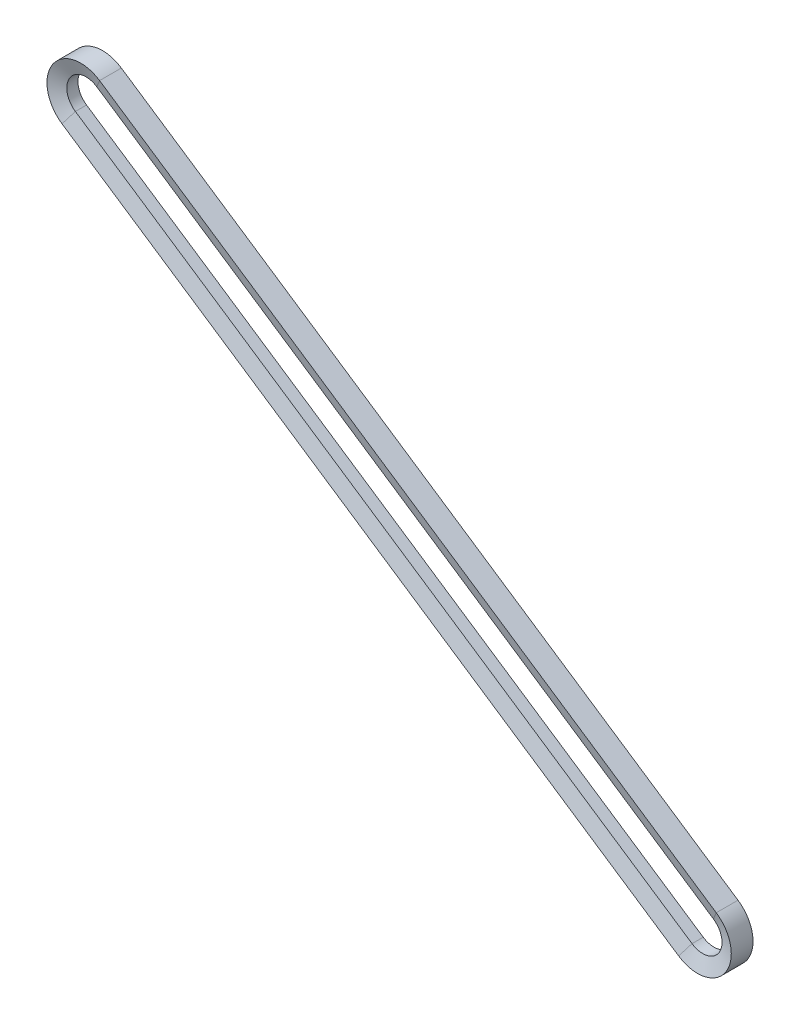
ISO-10303-21;
HEADER;
FILE_DESCRIPTION(('STEP AP214'),'2;1');
FILE_NAME('part.step','',(''),(''),'','','');
FILE_SCHEMA(('AUTOMOTIVE_DESIGN { 1 0 10303 214 1 1 1 1 }'));
ENDSEC;
DATA;
#1=APPLICATION_CONTEXT('core data for automotive mechanical design processes');
#2=APPLICATION_PROTOCOL_DEFINITION('international standard','automotive_design',2000,#1);
#3=PRODUCT_CONTEXT('',#1,'mechanical');
#4=PRODUCT('Part','Part','',(#3));
#5=PRODUCT_RELATED_PRODUCT_CATEGORY('part','',(#4));
#6=PRODUCT_DEFINITION_FORMATION('','',#4);
#7=PRODUCT_DEFINITION_CONTEXT('part definition',#1,'design');
#8=PRODUCT_DEFINITION('design','',#6,#7);
#9=PRODUCT_DEFINITION_SHAPE('','',#8);
#10=(LENGTH_UNIT() NAMED_UNIT(*) SI_UNIT(.MILLI.,.METRE.));
#11=(NAMED_UNIT(*) PLANE_ANGLE_UNIT() SI_UNIT($,.RADIAN.));
#12=(NAMED_UNIT(*) SI_UNIT($,.STERADIAN.) SOLID_ANGLE_UNIT());
#13=UNCERTAINTY_MEASURE_WITH_UNIT(LENGTH_MEASURE(1.E-05),#10,'distance_accuracy_value','');
#14=(GEOMETRIC_REPRESENTATION_CONTEXT(3) GLOBAL_UNCERTAINTY_ASSIGNED_CONTEXT((#13)) GLOBAL_UNIT_ASSIGNED_CONTEXT((#10,
#11,#12)) REPRESENTATION_CONTEXT('',''));
#15=CARTESIAN_POINT('',(0.,0.,0.));
#16=DIRECTION('',(0.,0.,1.));
#17=DIRECTION('',(1.,0.,0.));
#18=AXIS2_PLACEMENT_3D('',#15,#16,#17);
#19=CARTESIAN_POINT('',(2.94607949992243,4.40574801611716,1.535));
#20=DIRECTION('',(0.190116704315612,0.284312182610383,-0.939692620785909));
#21=DIRECTION('',(0.,0.95714959570632,0.289593942338628));
#22=AXIS2_PLACEMENT_3D('',#19,#20,#21);
#23=PLANE('',#22);
#24=DIRECTION('',(0.522341352168437,0.781141301797786,0.342020143325666));
#25=VECTOR('',#24,1.);
#26=CARTESIAN_POINT('',(2.94607949992248,4.40574801611737,1.535));
#27=LINE('',#26,#25);
#28=CARTESIAN_POINT('',(2.94607949992246,4.40574801611734,1.535));
#29=VERTEX_POINT('',#28);
#30=CARTESIAN_POINT('',(5.16953572641311,7.73084085826174,2.9908809370648));
#31=VERTEX_POINT('',#30);
#32=EDGE_CURVE('E155',#29,#31,#27,.T.);
#33=ORIENTED_EDGE('',*,*,#32,.F.);
#34=DIRECTION('',(0.831273210536213,-0.555864056622496,0.));
#35=VECTOR('',#34,1.);
#36=CARTESIAN_POINT('',(2.94607949992243,4.40574801611716,1.535));
#37=LINE('',#36,#35);
#38=CARTESIAN_POINT('',(172.541711907586,-109.001150005739,1.535));
#39=VERTEX_POINT('',#38);
#40=EDGE_CURVE('E154',#29,#39,#37,.T.);
#41=ORIENTED_EDGE('',*,*,#40,.T.);
#42=DIRECTION('',(0.522341352168437,0.781141301797786,0.342020143325666));
#43=VECTOR('',#42,1.);
#44=CARTESIAN_POINT('',(172.541711907586,-109.001150005739,1.535));
#45=LINE('',#44,#43);
#46=CARTESIAN_POINT('',(174.765168134077,-105.676057163595,2.9908809370648));
#47=VERTEX_POINT('',#46);
#48=EDGE_CURVE('E133',#39,#47,#45,.T.);
#49=ORIENTED_EDGE('',*,*,#48,.T.);
#50=DIRECTION('',(0.831273210536213,-0.555864056622496,0.));
#51=VECTOR('',#50,1.);
#52=CARTESIAN_POINT('',(5.16953572641307,7.73084085826156,2.9908809370648));
#53=LINE('',#52,#51);
#54=EDGE_CURVE('E159',#31,#47,#53,.T.);
#55=ORIENTED_EDGE('',*,*,#54,.F.);
#56=EDGE_LOOP('',(#33,#41,#49,#55));
#57=FACE_BOUND('',#56,.T.);
#58=ADVANCED_FACE('F39',(#57),#23,.F.);
#59=CARTESIAN_POINT('',(169.595632407486,-113.40689802158,1.535));
#60=DIRECTION('',(0.,0.,1.));
#61=DIRECTION('',(1.,0.,0.));
#62=AXIS2_PLACEMENT_3D('',#59,#60,#61);
#63=CONICAL_SURFACE('',#62,5.3,1.22173047639603);
#64=CARTESIAN_POINT('',(169.595632407486,-113.40689802158,2.9908809370648));
#65=DIRECTION('',(0.,0.,-1.));
#66=DIRECTION('',(0.555864056622663,0.831273210536101,0.));
#67=AXIS2_PLACEMENT_3D('',#64,#65,#66);
#68=CIRCLE('',#67,9.29999999999999);
#69=CARTESIAN_POINT('',(164.426096680895,-121.137738879566,2.9908809370648));
#70=VERTEX_POINT('',#69);
#71=EDGE_CURVE('E123',#47,#70,#68,.T.);
#72=ORIENTED_EDGE('',*,*,#71,.F.);
#73=ORIENTED_EDGE('',*,*,#48,.F.);
#74=CARTESIAN_POINT('',(169.595632407486,-113.40689802158,1.535));
#75=DIRECTION('',(0.,0.,-1.));
#76=DIRECTION('',(0.555864056622664,0.8312732105361,0.));
#77=AXIS2_PLACEMENT_3D('',#74,#75,#76);
#78=CIRCLE('',#77,5.3);
#79=CARTESIAN_POINT('',(166.649552907386,-117.812646037422,1.535));
#80=VERTEX_POINT('',#79);
#81=EDGE_CURVE('E136',#39,#80,#78,.T.);
#82=ORIENTED_EDGE('',*,*,#81,.T.);
#83=DIRECTION('',(-0.522341352168437,-0.781141301797786,0.342020143325666));
#84=VECTOR('',#83,1.);
#85=CARTESIAN_POINT('',(166.649552907386,-117.812646037422,1.535));
#86=LINE('',#85,#84);
#87=EDGE_CURVE('E151',#80,#70,#86,.T.);
#88=ORIENTED_EDGE('',*,*,#87,.T.);
#89=EDGE_LOOP('',(#72,#73,#82,#88));
#90=FACE_BOUND('',#89,.T.);
#91=ADVANCED_FACE('F135',(#90),#63,.F.);
#92=CARTESIAN_POINT('',(169.595632407486,-113.40689802158,0.));
#93=DIRECTION('',(0.,0.,-1.));
#94=DIRECTION('',(-1.,0.,0.));
#95=AXIS2_PLACEMENT_3D('',#92,#93,#94);
#96=CYLINDRICAL_SURFACE('',#95,9.29999999999999);
#97=CARTESIAN_POINT('',(169.595632407486,-113.40689802158,-2.99088093706479));
#98=DIRECTION('',(0.,0.,-1.));
#99=DIRECTION('',(0.555864056622663,0.831273210536101,0.));
#100=AXIS2_PLACEMENT_3D('',#97,#98,#99);
#101=CIRCLE('',#100,9.29999999999999);
#102=CARTESIAN_POINT('',(174.765168134077,-105.676057163595,-2.99088093706479));
#103=VERTEX_POINT('',#102);
#104=CARTESIAN_POINT('',(164.426096680895,-121.137738879566,-2.99088093706479));
#105=VERTEX_POINT('',#104);
#106=EDGE_CURVE('E117',#103,#105,#101,.T.);
#107=ORIENTED_EDGE('',*,*,#106,.F.);
#108=DIRECTION('',(0.,0.,1.));
#109=VECTOR('',#108,1.);
#110=CARTESIAN_POINT('',(174.765168134077,-105.676057163595,-2.99088093706479));
#111=LINE('',#110,#109);
#112=EDGE_CURVE('E141',#47,#103,#111,.F.);
#113=ORIENTED_EDGE('',*,*,#112,.F.);
#114=ORIENTED_EDGE('',*,*,#71,.T.);
#115=DIRECTION('',(0.,0.,1.));
#116=VECTOR('',#115,1.);
#117=CARTESIAN_POINT('',(164.426096680895,-121.137738879566,-2.99088093706479));
#118=LINE('',#117,#116);
#119=EDGE_CURVE('E199',#70,#105,#118,.F.);
#120=ORIENTED_EDGE('',*,*,#119,.T.);
#121=EDGE_LOOP('',(#107,#113,#114,#120));
#122=FACE_BOUND('',#121,.T.);
#123=ADVANCED_FACE('F218',(#122),#96,.T.);
#124=CARTESIAN_POINT('',(169.595632407486,-113.40689802158,-2.9908809370648));
#125=DIRECTION('',(0.,0.,-1.));
#126=DIRECTION('',(-1.,0.,0.));
#127=AXIS2_PLACEMENT_3D('',#124,#125,#126);
#128=CONICAL_SURFACE('',#127,9.29999999999999,1.22173047639603);
#129=CARTESIAN_POINT('',(169.595632407486,-113.40689802158,-1.535));
#130=DIRECTION('',(0.,0.,-1.));
#131=DIRECTION('',(0.555864056622664,0.8312732105361,0.));
#132=AXIS2_PLACEMENT_3D('',#129,#130,#131);
#133=CIRCLE('',#132,5.3);
#134=CARTESIAN_POINT('',(172.541711907586,-109.001150005739,-1.535));
#135=VERTEX_POINT('',#134);
#136=CARTESIAN_POINT('',(166.649552907386,-117.812646037422,-1.535));
#137=VERTEX_POINT('',#136);
#138=EDGE_CURVE('E169',#135,#137,#133,.T.);
#139=ORIENTED_EDGE('',*,*,#138,.F.);
#140=DIRECTION('',(0.522341352168437,0.781141301797786,-0.342020143325666));
#141=VECTOR('',#140,1.);
#142=CARTESIAN_POINT('',(172.541711907586,-109.001150005739,-1.535));
#143=LINE('',#142,#141);
#144=EDGE_CURVE('E162',#103,#135,#143,.F.);
#145=ORIENTED_EDGE('',*,*,#144,.F.);
#146=ORIENTED_EDGE('',*,*,#106,.T.);
#147=DIRECTION('',(-0.522341352168437,-0.781141301797786,-0.342020143325666));
#148=VECTOR('',#147,1.);
#149=CARTESIAN_POINT('',(166.649552907386,-117.812646037422,-1.535));
#150=LINE('',#149,#148);
#151=EDGE_CURVE('E187',#105,#137,#150,.F.);
#152=ORIENTED_EDGE('',*,*,#151,.T.);
#153=EDGE_LOOP('',(#139,#145,#146,#152));
#154=FACE_BOUND('',#153,.T.);
#155=ADVANCED_FACE('F186',(#154),#128,.F.);
#156=CARTESIAN_POINT('',(169.595632407486,-113.40689802158,0.));
#157=DIRECTION('',(0.,0.,-1.));
#158=DIRECTION('',(-1.,0.,0.));
#159=AXIS2_PLACEMENT_3D('',#156,#157,#158);
#160=CYLINDRICAL_SURFACE('',#159,5.3);
#161=DIRECTION('',(0.,0.,-1.));
#162=VECTOR('',#161,1.);
#163=CARTESIAN_POINT('',(166.649552907386,-117.812646037422,1.535));
#164=LINE('',#163,#162);
#165=EDGE_CURVE('E149',#137,#80,#164,.F.);
#166=ORIENTED_EDGE('',*,*,#165,.T.);
#167=ORIENTED_EDGE('',*,*,#81,.F.);
#168=DIRECTION('',(0.,0.,-1.));
#169=VECTOR('',#168,1.);
#170=CARTESIAN_POINT('',(172.541711907586,-109.001150005739,1.535));
#171=LINE('',#170,#169);
#172=EDGE_CURVE('E148',#135,#39,#171,.F.);
#173=ORIENTED_EDGE('',*,*,#172,.F.);
#174=ORIENTED_EDGE('',*,*,#138,.T.);
#175=EDGE_LOOP('',(#166,#167,#173,#174));
#176=FACE_BOUND('',#175,.T.);
#177=ADVANCED_FACE('F146',(#176),#160,.F.);
#178=CARTESIAN_POINT('',(166.649552907386,-117.812646037422,1.535));
#179=DIRECTION('',(-0.190116704315612,-0.284312182610382,-0.939692620785909));
#180=DIRECTION('',(0.,0.95714959570632,-0.289593942338628));
#181=AXIS2_PLACEMENT_3D('',#178,#179,#180);
#182=PLANE('',#181);
#183=DIRECTION('',(-0.831273210536213,0.555864056622496,0.));
#184=VECTOR('',#183,1.);
#185=CARTESIAN_POINT('',(164.426096680895,-121.137738879566,2.9908809370648));
#186=LINE('',#185,#184);
#187=CARTESIAN_POINT('',(-5.16953572676851,-7.73084085770966,2.9908809370648));
#188=VERTEX_POINT('',#187);
#189=EDGE_CURVE('E104',#70,#188,#186,.T.);
#190=ORIENTED_EDGE('',*,*,#189,.F.);
#191=ORIENTED_EDGE('',*,*,#87,.F.);
#192=DIRECTION('',(-0.831273210536213,0.555864056622496,0.));
#193=VECTOR('',#192,1.);
#194=CARTESIAN_POINT('',(166.649552907386,-117.812646037422,1.535));
#195=LINE('',#194,#193);
#196=CARTESIAN_POINT('',(-2.94607950027787,-4.40574801556526,1.535));
#197=VERTEX_POINT('',#196);
#198=EDGE_CURVE('E168',#80,#197,#195,.T.);
#199=ORIENTED_EDGE('',*,*,#198,.T.);
#200=DIRECTION('',(-0.522341352168436,-0.781141301797786,0.342020143325666));
#201=VECTOR('',#200,1.);
#202=CARTESIAN_POINT('',(-2.94607950027784,-4.40574801556527,1.535));
#203=LINE('',#202,#201);
#204=EDGE_CURVE('E209',#197,#188,#203,.T.);
#205=ORIENTED_EDGE('',*,*,#204,.T.);
#206=EDGE_LOOP('',(#190,#191,#199,#205));
#207=FACE_BOUND('',#206,.T.);
#208=ADVANCED_FACE('F214',(#207),#182,.F.);
#209=CARTESIAN_POINT('',(164.426096680895,-121.137738879566,-2.99088093706479));
#210=DIRECTION('',(0.555864056622496,0.831273210536213,0.));
#211=DIRECTION('',(-0.831273210536213,0.555864056622496,0.));
#212=AXIS2_PLACEMENT_3D('',#209,#210,#211);
#213=PLANE('',#212);
#214=DIRECTION('',(-0.831273210536213,0.555864056622496,0.));
#215=VECTOR('',#214,1.);
#216=CARTESIAN_POINT('',(164.426096680895,-121.137738879566,-2.99088093706479));
#217=LINE('',#216,#215);
#218=CARTESIAN_POINT('',(-5.16953572676851,-7.73084085770966,-2.99088093706479));
#219=VERTEX_POINT('',#218);
#220=EDGE_CURVE('E97',#105,#219,#217,.T.);
#221=ORIENTED_EDGE('',*,*,#220,.F.);
#222=ORIENTED_EDGE('',*,*,#119,.F.);
#223=ORIENTED_EDGE('',*,*,#189,.T.);
#224=DIRECTION('',(0.,0.,1.));
#225=VECTOR('',#224,1.);
#226=CARTESIAN_POINT('',(-5.16953572676848,-7.73084085770967,-2.99088093706479));
#227=LINE('',#226,#225);
#228=EDGE_CURVE('E196',#188,#219,#227,.F.);
#229=ORIENTED_EDGE('',*,*,#228,.T.);
#230=EDGE_LOOP('',(#221,#222,#223,#229));
#231=FACE_BOUND('',#230,.T.);
#232=ADVANCED_FACE('F217',(#231),#213,.F.);
#233=CARTESIAN_POINT('',(166.649552907386,-117.812646037422,-1.535));
#234=DIRECTION('',(-0.190116704315612,-0.284312182610382,0.939692620785909));
#235=DIRECTION('',(0.,-0.95714959570632,-0.289593942338628));
#236=AXIS2_PLACEMENT_3D('',#233,#234,#235);
#237=PLANE('',#236);
#238=DIRECTION('',(-0.831273210536213,0.555864056622496,0.));
#239=VECTOR('',#238,1.);
#240=CARTESIAN_POINT('',(166.649552907386,-117.812646037422,-1.535));
#241=LINE('',#240,#239);
#242=CARTESIAN_POINT('',(-2.94607950027787,-4.40574801556526,-1.535));
#243=VERTEX_POINT('',#242);
#244=EDGE_CURVE('E88',#137,#243,#241,.T.);
#245=ORIENTED_EDGE('',*,*,#244,.F.);
#246=ORIENTED_EDGE('',*,*,#151,.F.);
#247=ORIENTED_EDGE('',*,*,#220,.T.);
#248=DIRECTION('',(-0.522341352168436,-0.781141301797787,-0.342020143325666));
#249=VECTOR('',#248,1.);
#250=CARTESIAN_POINT('',(-2.94607950027784,-4.40574801556527,-1.535));
#251=LINE('',#250,#249);
#252=EDGE_CURVE('E174',#219,#243,#251,.F.);
#253=ORIENTED_EDGE('',*,*,#252,.T.);
#254=EDGE_LOOP('',(#245,#246,#247,#253));
#255=FACE_BOUND('',#254,.T.);
#256=ADVANCED_FACE('F236',(#255),#237,.F.);
#257=CARTESIAN_POINT('',(166.649552907386,-117.812646037422,1.535));
#258=DIRECTION('',(-0.555864056622496,-0.831273210536213,0.));
#259=DIRECTION('',(0.831273210536213,-0.555864056622496,0.));
#260=AXIS2_PLACEMENT_3D('',#257,#258,#259);
#261=PLANE('',#260);
#262=DIRECTION('',(0.,0.,-1.));
#263=VECTOR('',#262,1.);
#264=CARTESIAN_POINT('',(-2.94607950027784,-4.40574801556527,1.535));
#265=LINE('',#264,#263);
#266=EDGE_CURVE('E170',#243,#197,#265,.F.);
#267=ORIENTED_EDGE('',*,*,#266,.T.);
#268=ORIENTED_EDGE('',*,*,#198,.F.);
#269=ORIENTED_EDGE('',*,*,#165,.F.);
#270=ORIENTED_EDGE('',*,*,#244,.T.);
#271=EDGE_LOOP('',(#267,#268,#269,#270));
#272=FACE_BOUND('',#271,.T.);
#273=ADVANCED_FACE('F228',(#272),#261,.F.);
#274=CARTESIAN_POINT('',(-1.77635683940025E-10,2.76001443921814E-10,1.535));
#275=DIRECTION('',(0.,0.,1.));
#276=DIRECTION('',(1.,0.,0.));
#277=AXIS2_PLACEMENT_3D('',#274,#275,#276);
#278=CONICAL_SURFACE('',#277,5.3,1.22173047639603);
#279=CARTESIAN_POINT('',(-1.77635683940025E-10,2.76001443921814E-10,2.9908809370648));
#280=DIRECTION('',(0.,0.,-1.));
#281=DIRECTION('',(-0.555864056622663,-0.831273210536101,0.));
#282=AXIS2_PLACEMENT_3D('',#279,#280,#281);
#283=CIRCLE('',#282,9.29999999999999);
#284=EDGE_CURVE('E194',#188,#31,#283,.T.);
#285=ORIENTED_EDGE('',*,*,#284,.F.);
#286=ORIENTED_EDGE('',*,*,#204,.F.);
#287=CARTESIAN_POINT('',(-1.77635683940025E-10,2.76001443921814E-10,1.535));
#288=DIRECTION('',(0.,0.,-1.));
#289=DIRECTION('',(-0.555864056622664,-0.8312732105361,0.));
#290=AXIS2_PLACEMENT_3D('',#287,#288,#289);
#291=CIRCLE('',#290,5.3);
#292=EDGE_CURVE('E171',#197,#29,#291,.T.);
#293=ORIENTED_EDGE('',*,*,#292,.T.);
#294=ORIENTED_EDGE('',*,*,#32,.T.);
#295=EDGE_LOOP('',(#285,#286,#293,#294));
#296=FACE_BOUND('',#295,.T.);
#297=ADVANCED_FACE('F226',(#296),#278,.F.);
#298=CARTESIAN_POINT('',(-1.77635683940025E-10,2.76001443921814E-10,0.));
#299=DIRECTION('',(0.,0.,-1.));
#300=DIRECTION('',(-1.,0.,0.));
#301=AXIS2_PLACEMENT_3D('',#298,#299,#300);
#302=CYLINDRICAL_SURFACE('',#301,9.29999999999999);
#303=CARTESIAN_POINT('',(-1.77635683940025E-10,2.76001443921814E-10,-2.99088093706479));
#304=DIRECTION('',(0.,0.,-1.));
#305=DIRECTION('',(-0.555864056622663,-0.831273210536101,0.));
#306=AXIS2_PLACEMENT_3D('',#303,#304,#305);
#307=CIRCLE('',#306,9.29999999999999);
#308=CARTESIAN_POINT('',(5.16953572641311,7.73084085826174,-2.99088093706479));
#309=VERTEX_POINT('',#308);
#310=EDGE_CURVE('E64',#219,#309,#307,.T.);
#311=ORIENTED_EDGE('',*,*,#310,.F.);
#312=ORIENTED_EDGE('',*,*,#228,.F.);
#313=ORIENTED_EDGE('',*,*,#284,.T.);
#314=DIRECTION('',(0.,0.,1.));
#315=VECTOR('',#314,1.);
#316=CARTESIAN_POINT('',(5.16953572641313,7.73084085826177,-2.99088093706479));
#317=LINE('',#316,#315);
#318=EDGE_CURVE('E192',#31,#309,#317,.F.);
#319=ORIENTED_EDGE('',*,*,#318,.T.);
#320=EDGE_LOOP('',(#311,#312,#313,#319));
#321=FACE_BOUND('',#320,.T.);
#322=ADVANCED_FACE('F223',(#321),#302,.T.);
#323=CARTESIAN_POINT('',(-1.77635683940025E-10,2.76001443921814E-10,-2.9908809370648));
#324=DIRECTION('',(0.,0.,-1.));
#325=DIRECTION('',(-1.,0.,0.));
#326=AXIS2_PLACEMENT_3D('',#323,#324,#325);
#327=CONICAL_SURFACE('',#326,9.29999999999999,1.22173047639603);
#328=CARTESIAN_POINT('',(-1.77635683940025E-10,2.76001443921814E-10,-1.535));
#329=DIRECTION('',(0.,0.,-1.));
#330=DIRECTION('',(-0.555864056622664,-0.8312732105361,0.));
#331=AXIS2_PLACEMENT_3D('',#328,#329,#330);
#332=CIRCLE('',#331,5.3);
#333=CARTESIAN_POINT('',(2.94607949992246,4.40574801611734,-1.535));
#334=VERTEX_POINT('',#333);
#335=EDGE_CURVE('E56',#243,#334,#332,.T.);
#336=ORIENTED_EDGE('',*,*,#335,.F.);
#337=ORIENTED_EDGE('',*,*,#252,.F.);
#338=ORIENTED_EDGE('',*,*,#310,.T.);
#339=DIRECTION('',(0.522341352168437,0.781141301797786,-0.342020143325666));
#340=VECTOR('',#339,1.);
#341=CARTESIAN_POINT('',(2.94607949992248,4.40574801611737,-1.535));
#342=LINE('',#341,#340);
#343=EDGE_CURVE('E179',#309,#334,#342,.F.);
#344=ORIENTED_EDGE('',*,*,#343,.T.);
#345=EDGE_LOOP('',(#336,#337,#338,#344));
#346=FACE_BOUND('',#345,.T.);
#347=ADVANCED_FACE('F234',(#346),#327,.F.);
#348=CARTESIAN_POINT('',(-1.77635683940025E-10,2.76001443921814E-10,0.));
#349=DIRECTION('',(0.,0.,-1.));
#350=DIRECTION('',(-1.,0.,0.));
#351=AXIS2_PLACEMENT_3D('',#348,#349,#350);
#352=CYLINDRICAL_SURFACE('',#351,5.3);
#353=DIRECTION('',(0.,0.,-1.));
#354=VECTOR('',#353,1.);
#355=CARTESIAN_POINT('',(2.94607949992248,4.40574801611737,1.535));
#356=LINE('',#355,#354);
#357=EDGE_CURVE('E43',#334,#29,#356,.F.);
#358=ORIENTED_EDGE('',*,*,#357,.T.);
#359=ORIENTED_EDGE('',*,*,#292,.F.);
#360=ORIENTED_EDGE('',*,*,#266,.F.);
#361=ORIENTED_EDGE('',*,*,#335,.T.);
#362=EDGE_LOOP('',(#358,#359,#360,#361));
#363=FACE_BOUND('',#362,.T.);
#364=ADVANCED_FACE('F180',(#363),#352,.F.);
#365=CARTESIAN_POINT('',(5.16953572641307,7.73084085826156,-2.99088093706479));
#366=DIRECTION('',(-0.555864056622496,-0.831273210536213,0.));
#367=DIRECTION('',(0.831273210536213,-0.555864056622496,0.));
#368=AXIS2_PLACEMENT_3D('',#365,#366,#367);
#369=PLANE('',#368);
#370=ORIENTED_EDGE('',*,*,#54,.T.);
#371=ORIENTED_EDGE('',*,*,#112,.T.);
#372=DIRECTION('',(0.831273210536213,-0.555864056622496,0.));
#373=VECTOR('',#372,1.);
#374=CARTESIAN_POINT('',(5.16953572641307,7.73084085826156,-2.99088093706479));
#375=LINE('',#374,#373);
#376=EDGE_CURVE('E48',#309,#103,#375,.T.);
#377=ORIENTED_EDGE('',*,*,#376,.F.);
#378=ORIENTED_EDGE('',*,*,#318,.F.);
#379=EDGE_LOOP('',(#370,#371,#377,#378));
#380=FACE_BOUND('',#379,.T.);
#381=ADVANCED_FACE('F220',(#380),#369,.F.);
#382=CARTESIAN_POINT('',(2.94607949992243,4.40574801611716,-1.535));
#383=DIRECTION('',(0.190116704315612,0.284312182610382,0.939692620785909));
#384=DIRECTION('',(0.,-0.95714959570632,0.289593942338628));
#385=AXIS2_PLACEMENT_3D('',#382,#383,#384);
#386=PLANE('',#385);
#387=ORIENTED_EDGE('',*,*,#376,.T.);
#388=ORIENTED_EDGE('',*,*,#144,.T.);
#389=DIRECTION('',(0.831273210536213,-0.555864056622496,0.));
#390=VECTOR('',#389,1.);
#391=CARTESIAN_POINT('',(2.94607949992243,4.40574801611716,-1.535));
#392=LINE('',#391,#390);
#393=EDGE_CURVE('E11',#334,#135,#392,.T.);
#394=ORIENTED_EDGE('',*,*,#393,.F.);
#395=ORIENTED_EDGE('',*,*,#343,.F.);
#396=EDGE_LOOP('',(#387,#388,#394,#395));
#397=FACE_BOUND('',#396,.T.);
#398=ADVANCED_FACE('F184',(#397),#386,.F.);
#399=CARTESIAN_POINT('',(2.94607949992243,4.40574801611716,1.535));
#400=DIRECTION('',(0.555864056622496,0.831273210536213,0.));
#401=DIRECTION('',(-0.831273210536213,0.555864056622496,0.));
#402=AXIS2_PLACEMENT_3D('',#399,#400,#401);
#403=PLANE('',#402);
#404=ORIENTED_EDGE('',*,*,#393,.T.);
#405=ORIENTED_EDGE('',*,*,#172,.T.);
#406=ORIENTED_EDGE('',*,*,#40,.F.);
#407=ORIENTED_EDGE('',*,*,#357,.F.);
#408=EDGE_LOOP('',(#404,#405,#406,#407));
#409=FACE_BOUND('',#408,.T.);
#410=ADVANCED_FACE('F41',(#409),#403,.F.);
#411=CLOSED_SHELL('',(#58,#91,#123,#155,#177,#208,#232,#256,#273,#297,#322,#347,#364,#381,#398,#410));
#412=MANIFOLD_SOLID_BREP('B2',#411);
#413=ADVANCED_BREP_SHAPE_REPRESENTATION('',(#18,#412),#14);
#414=SHAPE_DEFINITION_REPRESENTATION(#9,#413);
ENDSEC;
END-ISO-10303-21;
